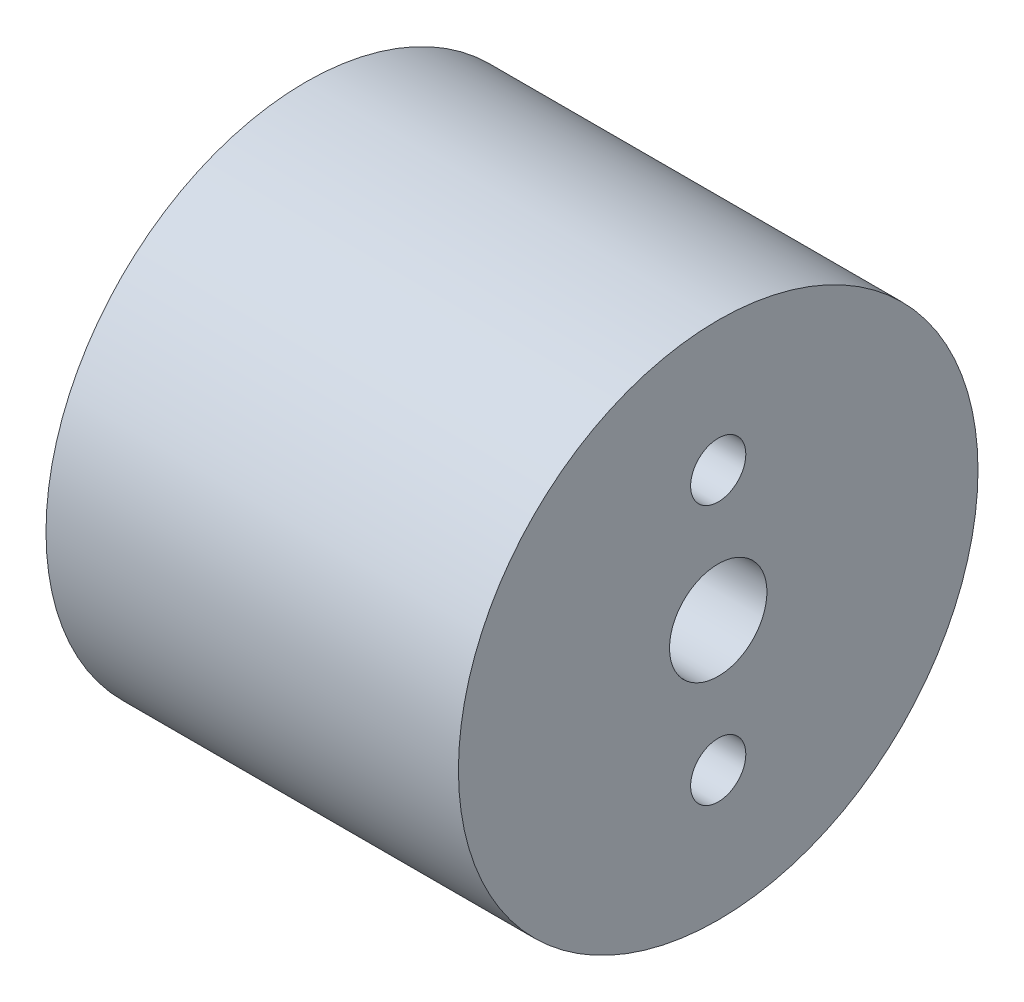
ISO-10303-21;
HEADER;
FILE_DESCRIPTION(('STEP AP214'),'2;1');
FILE_NAME('part.step','',(''),(''),'','','');
FILE_SCHEMA(('AUTOMOTIVE_DESIGN { 1 0 10303 214 1 1 1 1 }'));
ENDSEC;
DATA;
#1=APPLICATION_CONTEXT('core data for automotive mechanical design processes');
#2=APPLICATION_PROTOCOL_DEFINITION('international standard','automotive_design',2000,#1);
#3=PRODUCT_CONTEXT('',#1,'mechanical');
#4=PRODUCT('Part','Part','',(#3));
#5=PRODUCT_RELATED_PRODUCT_CATEGORY('part','',(#4));
#6=PRODUCT_DEFINITION_FORMATION('','',#4);
#7=PRODUCT_DEFINITION_CONTEXT('part definition',#1,'design');
#8=PRODUCT_DEFINITION('design','',#6,#7);
#9=PRODUCT_DEFINITION_SHAPE('','',#8);
#10=(LENGTH_UNIT() NAMED_UNIT(*) SI_UNIT(.MILLI.,.METRE.));
#11=(NAMED_UNIT(*) PLANE_ANGLE_UNIT() SI_UNIT($,.RADIAN.));
#12=(NAMED_UNIT(*) SI_UNIT($,.STERADIAN.) SOLID_ANGLE_UNIT());
#13=UNCERTAINTY_MEASURE_WITH_UNIT(LENGTH_MEASURE(1.E-05),#10,'distance_accuracy_value','');
#14=(GEOMETRIC_REPRESENTATION_CONTEXT(3) GLOBAL_UNCERTAINTY_ASSIGNED_CONTEXT((#13)) GLOBAL_UNIT_ASSIGNED_CONTEXT((#10,
#11,#12)) REPRESENTATION_CONTEXT('',''));
#15=CARTESIAN_POINT('',(0.,0.,0.));
#16=DIRECTION('',(0.,0.,1.));
#17=DIRECTION('',(1.,0.,0.));
#18=AXIS2_PLACEMENT_3D('',#15,#16,#17);
#19=CARTESIAN_POINT('',(0.,0.,0.));
#20=DIRECTION('',(1.,0.,0.));
#21=DIRECTION('',(0.,0.,-1.));
#22=AXIS2_PLACEMENT_3D('',#19,#20,#21);
#23=PLANE('',#22);
#24=CARTESIAN_POINT('',(0.,0.,0.));
#25=DIRECTION('',(1.,0.,0.));
#26=DIRECTION('',(0.,0.,-1.));
#27=AXIS2_PLACEMENT_3D('',#24,#25,#26);
#28=CIRCLE('',#27,16.);
#29=CARTESIAN_POINT('',(0.,0.,-16.));
#30=VERTEX_POINT('',#29);
#31=EDGE_CURVE('E10',#30,#30,#28,.T.);
#32=ORIENTED_EDGE('',*,*,#31,.F.);
#33=EDGE_LOOP('',(#32));
#34=FACE_BOUND('',#33,.T.);
#35=CARTESIAN_POINT('',(0.,0.,0.));
#36=DIRECTION('',(1.,0.,0.));
#37=DIRECTION('',(0.,0.,-1.));
#38=AXIS2_PLACEMENT_3D('',#35,#36,#37);
#39=CIRCLE('',#38,11.4);
#40=CARTESIAN_POINT('',(0.,0.,-11.4));
#41=VERTEX_POINT('',#40);
#42=EDGE_CURVE('E38',#41,#41,#39,.T.);
#43=ORIENTED_EDGE('',*,*,#42,.T.);
#44=EDGE_LOOP('',(#43));
#45=FACE_BOUND('',#44,.T.);
#46=ADVANCED_FACE('F31',(#34,#45),#23,.F.);
#47=CARTESIAN_POINT('',(6.7,0.,0.));
#48=DIRECTION('',(-1.,0.,0.));
#49=DIRECTION('',(0.,0.,1.));
#50=AXIS2_PLACEMENT_3D('',#47,#48,#49);
#51=CYLINDRICAL_SURFACE('',#50,16.);
#52=ORIENTED_EDGE('',*,*,#31,.T.);
#53=EDGE_LOOP('',(#52));
#54=FACE_BOUND('',#53,.T.);
#55=CARTESIAN_POINT('',(25.4,0.,0.));
#56=DIRECTION('',(1.,0.,0.));
#57=DIRECTION('',(0.,0.,-1.));
#58=AXIS2_PLACEMENT_3D('',#55,#56,#57);
#59=CIRCLE('',#58,16.);
#60=CARTESIAN_POINT('',(25.4,0.,-16.));
#61=VERTEX_POINT('',#60);
#62=EDGE_CURVE('E66',#61,#61,#59,.T.);
#63=ORIENTED_EDGE('',*,*,#62,.F.);
#64=EDGE_LOOP('',(#63));
#65=FACE_BOUND('',#64,.T.);
#66=ADVANCED_FACE('F33',(#54,#65),#51,.T.);
#67=CARTESIAN_POINT('',(6.7,0.,0.));
#68=DIRECTION('',(-1.,0.,0.));
#69=DIRECTION('',(0.,0.,1.));
#70=AXIS2_PLACEMENT_3D('',#67,#68,#69);
#71=CYLINDRICAL_SURFACE('',#70,11.4);
#72=CARTESIAN_POINT('',(6.7,0.,0.));
#73=DIRECTION('',(1.,0.,0.));
#74=DIRECTION('',(0.,0.,-1.));
#75=AXIS2_PLACEMENT_3D('',#72,#73,#74);
#76=CIRCLE('',#75,11.4);
#77=CARTESIAN_POINT('',(6.7,0.,-11.4));
#78=VERTEX_POINT('',#77);
#79=EDGE_CURVE('E42',#78,#78,#76,.T.);
#80=ORIENTED_EDGE('',*,*,#79,.T.);
#81=EDGE_LOOP('',(#80));
#82=FACE_BOUND('',#81,.T.);
#83=ORIENTED_EDGE('',*,*,#42,.F.);
#84=EDGE_LOOP('',(#83));
#85=FACE_BOUND('',#84,.T.);
#86=ADVANCED_FACE('F148',(#82,#85),#71,.F.);
#87=CARTESIAN_POINT('',(6.7,0.,0.));
#88=DIRECTION('',(1.,0.,0.));
#89=DIRECTION('',(0.,0.,-1.));
#90=AXIS2_PLACEMENT_3D('',#87,#88,#89);
#91=PLANE('',#90);
#92=CARTESIAN_POINT('',(6.7,0.,0.));
#93=DIRECTION('',(1.,0.,0.));
#94=DIRECTION('',(0.,0.,-1.));
#95=AXIS2_PLACEMENT_3D('',#92,#93,#94);
#96=CIRCLE('',#95,10.7);
#97=CARTESIAN_POINT('',(6.7,0.,-10.7));
#98=VERTEX_POINT('',#97);
#99=EDGE_CURVE('E46',#98,#98,#96,.T.);
#100=ORIENTED_EDGE('',*,*,#99,.T.);
#101=EDGE_LOOP('',(#100));
#102=FACE_BOUND('',#101,.T.);
#103=ORIENTED_EDGE('',*,*,#79,.F.);
#104=EDGE_LOOP('',(#103));
#105=FACE_BOUND('',#104,.T.);
#106=ADVANCED_FACE('F142',(#102,#105),#91,.F.);
#107=CARTESIAN_POINT('',(9.9,0.,0.));
#108=DIRECTION('',(-1.,0.,0.));
#109=DIRECTION('',(0.,0.,1.));
#110=AXIS2_PLACEMENT_3D('',#107,#108,#109);
#111=CYLINDRICAL_SURFACE('',#110,10.7);
#112=CARTESIAN_POINT('',(9.9,0.,0.));
#113=DIRECTION('',(1.,0.,0.));
#114=DIRECTION('',(0.,0.,-1.));
#115=AXIS2_PLACEMENT_3D('',#112,#113,#114);
#116=CIRCLE('',#115,10.7);
#117=CARTESIAN_POINT('',(9.9,0.,-10.7));
#118=VERTEX_POINT('',#117);
#119=EDGE_CURVE('E51',#118,#118,#116,.T.);
#120=ORIENTED_EDGE('',*,*,#119,.T.);
#121=EDGE_LOOP('',(#120));
#122=FACE_BOUND('',#121,.T.);
#123=ORIENTED_EDGE('',*,*,#99,.F.);
#124=EDGE_LOOP('',(#123));
#125=FACE_BOUND('',#124,.T.);
#126=ADVANCED_FACE('F135',(#122,#125),#111,.F.);
#127=CARTESIAN_POINT('',(9.9,0.,0.));
#128=DIRECTION('',(1.,0.,0.));
#129=DIRECTION('',(0.,0.,-1.));
#130=AXIS2_PLACEMENT_3D('',#127,#128,#129);
#131=PLANE('',#130);
#132=CARTESIAN_POINT('',(9.9,8.,0.));
#133=DIRECTION('',(1.,0.,0.));
#134=DIRECTION('',(0.,0.,-1.));
#135=AXIS2_PLACEMENT_3D('',#132,#133,#134);
#136=CIRCLE('',#135,1.7);
#137=CARTESIAN_POINT('',(9.9,8.,-1.7));
#138=VERTEX_POINT('',#137);
#139=EDGE_CURVE('E73',#138,#138,#136,.T.);
#140=ORIENTED_EDGE('',*,*,#139,.T.);
#141=EDGE_LOOP('',(#140));
#142=FACE_BOUND('',#141,.T.);
#143=CARTESIAN_POINT('',(9.9,-8.,0.));
#144=DIRECTION('',(1.,0.,0.));
#145=DIRECTION('',(0.,0.,-1.));
#146=AXIS2_PLACEMENT_3D('',#143,#144,#145);
#147=CIRCLE('',#146,1.7);
#148=CARTESIAN_POINT('',(9.9,-8.,-1.7));
#149=VERTEX_POINT('',#148);
#150=EDGE_CURVE('E78',#149,#149,#147,.T.);
#151=ORIENTED_EDGE('',*,*,#150,.T.);
#152=EDGE_LOOP('',(#151));
#153=FACE_BOUND('',#152,.T.);
#154=CARTESIAN_POINT('',(9.9,0.,0.));
#155=DIRECTION('',(1.,0.,0.));
#156=DIRECTION('',(0.,0.,-1.));
#157=AXIS2_PLACEMENT_3D('',#154,#155,#156);
#158=CIRCLE('',#157,6.2);
#159=CARTESIAN_POINT('',(9.9,0.,-6.2));
#160=VERTEX_POINT('',#159);
#161=EDGE_CURVE('E54',#160,#160,#158,.T.);
#162=ORIENTED_EDGE('',*,*,#161,.T.);
#163=EDGE_LOOP('',(#162));
#164=FACE_BOUND('',#163,.T.);
#165=ORIENTED_EDGE('',*,*,#119,.F.);
#166=EDGE_LOOP('',(#165));
#167=FACE_BOUND('',#166,.T.);
#168=ADVANCED_FACE('F129',(#142,#153,#164,#167),#131,.F.);
#169=CARTESIAN_POINT('',(10.9,0.,0.));
#170=DIRECTION('',(-1.,0.,0.));
#171=DIRECTION('',(0.,0.,1.));
#172=AXIS2_PLACEMENT_3D('',#169,#170,#171);
#173=CYLINDRICAL_SURFACE('',#172,6.2);
#174=CARTESIAN_POINT('',(10.9,0.,0.));
#175=DIRECTION('',(1.,0.,0.));
#176=DIRECTION('',(0.,0.,-1.));
#177=AXIS2_PLACEMENT_3D('',#174,#175,#176);
#178=CIRCLE('',#177,6.2);
#179=CARTESIAN_POINT('',(10.9,0.,-6.2));
#180=VERTEX_POINT('',#179);
#181=EDGE_CURVE('E57',#180,#180,#178,.T.);
#182=ORIENTED_EDGE('',*,*,#181,.T.);
#183=EDGE_LOOP('',(#182));
#184=FACE_BOUND('',#183,.T.);
#185=ORIENTED_EDGE('',*,*,#161,.F.);
#186=EDGE_LOOP('',(#185));
#187=FACE_BOUND('',#186,.T.);
#188=ADVANCED_FACE('F123',(#184,#187),#173,.F.);
#189=CARTESIAN_POINT('',(10.9,0.,0.));
#190=DIRECTION('',(1.,0.,0.));
#191=DIRECTION('',(0.,0.,-1.));
#192=AXIS2_PLACEMENT_3D('',#189,#190,#191);
#193=PLANE('',#192);
#194=CARTESIAN_POINT('',(10.9,0.,0.));
#195=DIRECTION('',(1.,0.,0.));
#196=DIRECTION('',(0.,0.,-1.));
#197=AXIS2_PLACEMENT_3D('',#194,#195,#196);
#198=CIRCLE('',#197,4.7);
#199=CARTESIAN_POINT('',(10.9,0.,-4.7));
#200=VERTEX_POINT('',#199);
#201=EDGE_CURVE('E60',#200,#200,#198,.T.);
#202=ORIENTED_EDGE('',*,*,#201,.T.);
#203=EDGE_LOOP('',(#202));
#204=FACE_BOUND('',#203,.T.);
#205=ORIENTED_EDGE('',*,*,#181,.F.);
#206=EDGE_LOOP('',(#205));
#207=FACE_BOUND('',#206,.T.);
#208=ADVANCED_FACE('F117',(#204,#207),#193,.F.);
#209=CARTESIAN_POINT('',(17.9,0.,0.));
#210=DIRECTION('',(-1.,0.,0.));
#211=DIRECTION('',(0.,0.,1.));
#212=AXIS2_PLACEMENT_3D('',#209,#210,#211);
#213=CYLINDRICAL_SURFACE('',#212,4.7);
#214=CARTESIAN_POINT('',(17.9,0.,0.));
#215=DIRECTION('',(1.,0.,0.));
#216=DIRECTION('',(0.,0.,-1.));
#217=AXIS2_PLACEMENT_3D('',#214,#215,#216);
#218=CIRCLE('',#217,4.7);
#219=CARTESIAN_POINT('',(17.9,0.,-4.7));
#220=VERTEX_POINT('',#219);
#221=EDGE_CURVE('E63',#220,#220,#218,.T.);
#222=ORIENTED_EDGE('',*,*,#221,.T.);
#223=EDGE_LOOP('',(#222));
#224=FACE_BOUND('',#223,.T.);
#225=ORIENTED_EDGE('',*,*,#201,.F.);
#226=EDGE_LOOP('',(#225));
#227=FACE_BOUND('',#226,.T.);
#228=ADVANCED_FACE('F111',(#224,#227),#213,.F.);
#229=CARTESIAN_POINT('',(17.9,0.,0.));
#230=DIRECTION('',(1.,0.,0.));
#231=DIRECTION('',(0.,0.,-1.));
#232=AXIS2_PLACEMENT_3D('',#229,#230,#231);
#233=PLANE('',#232);
#234=CARTESIAN_POINT('',(17.9,0.,0.));
#235=DIRECTION('',(1.,0.,0.));
#236=DIRECTION('',(0.,0.,-1.));
#237=AXIS2_PLACEMENT_3D('',#234,#235,#236);
#238=CIRCLE('',#237,3.);
#239=CARTESIAN_POINT('',(17.9,0.,3.));
#240=VERTEX_POINT('',#239);
#241=EDGE_CURVE('E70',#240,#240,#238,.T.);
#242=ORIENTED_EDGE('',*,*,#241,.T.);
#243=EDGE_LOOP('',(#242));
#244=FACE_BOUND('',#243,.T.);
#245=ORIENTED_EDGE('',*,*,#221,.F.);
#246=EDGE_LOOP('',(#245));
#247=FACE_BOUND('',#246,.T.);
#248=ADVANCED_FACE('F95',(#244,#247),#233,.F.);
#249=CARTESIAN_POINT('',(25.4,0.,0.));
#250=DIRECTION('',(1.,0.,0.));
#251=DIRECTION('',(0.,0.,-1.));
#252=AXIS2_PLACEMENT_3D('',#249,#250,#251);
#253=PLANE('',#252);
#254=CARTESIAN_POINT('',(25.4,8.,0.));
#255=DIRECTION('',(1.,0.,0.));
#256=DIRECTION('',(0.,0.,-1.));
#257=AXIS2_PLACEMENT_3D('',#254,#255,#256);
#258=CIRCLE('',#257,1.7);
#259=CARTESIAN_POINT('',(25.4,8.,-1.7));
#260=VERTEX_POINT('',#259);
#261=EDGE_CURVE('E81',#260,#260,#258,.T.);
#262=ORIENTED_EDGE('',*,*,#261,.F.);
#263=EDGE_LOOP('',(#262));
#264=FACE_BOUND('',#263,.T.);
#265=CARTESIAN_POINT('',(25.4,-8.,0.));
#266=DIRECTION('',(1.,0.,0.));
#267=DIRECTION('',(0.,0.,-1.));
#268=AXIS2_PLACEMENT_3D('',#265,#266,#267);
#269=CIRCLE('',#268,1.7);
#270=CARTESIAN_POINT('',(25.4,-8.,-1.7));
#271=VERTEX_POINT('',#270);
#272=EDGE_CURVE('E82',#271,#271,#269,.T.);
#273=ORIENTED_EDGE('',*,*,#272,.F.);
#274=EDGE_LOOP('',(#273));
#275=FACE_BOUND('',#274,.T.);
#276=ORIENTED_EDGE('',*,*,#62,.T.);
#277=EDGE_LOOP('',(#276));
#278=FACE_BOUND('',#277,.T.);
#279=CARTESIAN_POINT('',(25.4,0.,0.));
#280=DIRECTION('',(1.,0.,0.));
#281=DIRECTION('',(0.,0.,-1.));
#282=AXIS2_PLACEMENT_3D('',#279,#280,#281);
#283=CIRCLE('',#282,3.);
#284=CARTESIAN_POINT('',(25.4,0.,3.));
#285=VERTEX_POINT('',#284);
#286=EDGE_CURVE('E69',#285,#285,#283,.T.);
#287=ORIENTED_EDGE('',*,*,#286,.F.);
#288=EDGE_LOOP('',(#287));
#289=FACE_BOUND('',#288,.T.);
#290=ADVANCED_FACE('F91',(#264,#275,#278,#289),#253,.T.);
#291=CARTESIAN_POINT('',(25.4,0.,0.));
#292=DIRECTION('',(-1.,0.,0.));
#293=DIRECTION('',(0.,0.,1.));
#294=AXIS2_PLACEMENT_3D('',#291,#292,#293);
#295=CYLINDRICAL_SURFACE('',#294,3.);
#296=CARTESIAN_POINT('',(25.4,0.,3.));
#297=CARTESIAN_POINT('',(25.321875,0.,3.));
#298=CARTESIAN_POINT('',(25.24375,0.,3.));
#299=CARTESIAN_POINT('',(25.0875,0.,3.));
#300=CARTESIAN_POINT('',(25.009375,0.,3.));
#301=CARTESIAN_POINT('',(24.853125,0.,3.));
#302=CARTESIAN_POINT('',(24.775,0.,3.));
#303=CARTESIAN_POINT('',(24.61875,0.,3.));
#304=CARTESIAN_POINT('',(24.540625,0.,3.));
#305=CARTESIAN_POINT('',(24.384375,0.,3.));
#306=CARTESIAN_POINT('',(24.30625,0.,3.));
#307=CARTESIAN_POINT('',(24.15,0.,3.));
#308=CARTESIAN_POINT('',(24.071875,0.,3.));
#309=CARTESIAN_POINT('',(23.915625,0.,3.));
#310=CARTESIAN_POINT('',(23.8375,0.,3.));
#311=CARTESIAN_POINT('',(23.68125,0.,3.));
#312=CARTESIAN_POINT('',(23.603125,0.,3.));
#313=CARTESIAN_POINT('',(23.446875,0.,3.));
#314=CARTESIAN_POINT('',(23.36875,0.,3.));
#315=CARTESIAN_POINT('',(23.2125,0.,3.));
#316=CARTESIAN_POINT('',(23.134375,0.,3.));
#317=CARTESIAN_POINT('',(22.978125,0.,3.));
#318=CARTESIAN_POINT('',(22.9,0.,3.));
#319=CARTESIAN_POINT('',(22.74375,0.,3.));
#320=CARTESIAN_POINT('',(22.665625,0.,3.));
#321=CARTESIAN_POINT('',(22.509375,0.,3.));
#322=CARTESIAN_POINT('',(22.43125,0.,3.));
#323=CARTESIAN_POINT('',(22.275,0.,3.));
#324=CARTESIAN_POINT('',(22.196875,0.,3.));
#325=CARTESIAN_POINT('',(22.040625,0.,3.));
#326=CARTESIAN_POINT('',(21.9625,0.,3.));
#327=CARTESIAN_POINT('',(21.80625,0.,3.));
#328=CARTESIAN_POINT('',(21.728125,0.,3.));
#329=CARTESIAN_POINT('',(21.571875,0.,3.));
#330=CARTESIAN_POINT('',(21.49375,0.,3.));
#331=CARTESIAN_POINT('',(21.3375,0.,3.));
#332=CARTESIAN_POINT('',(21.259375,0.,3.));
#333=CARTESIAN_POINT('',(21.103125,0.,3.));
#334=CARTESIAN_POINT('',(21.025,0.,3.));
#335=CARTESIAN_POINT('',(20.86875,0.,3.));
#336=CARTESIAN_POINT('',(20.790625,0.,3.));
#337=CARTESIAN_POINT('',(20.634375,0.,3.));
#338=CARTESIAN_POINT('',(20.55625,0.,3.));
#339=CARTESIAN_POINT('',(20.4,0.,3.));
#340=CARTESIAN_POINT('',(20.321875,0.,3.));
#341=CARTESIAN_POINT('',(20.165625,0.,3.));
#342=CARTESIAN_POINT('',(20.0875,0.,3.));
#343=CARTESIAN_POINT('',(19.93125,0.,3.));
#344=CARTESIAN_POINT('',(19.853125,0.,3.));
#345=CARTESIAN_POINT('',(19.696875,0.,3.));
#346=CARTESIAN_POINT('',(19.61875,0.,3.));
#347=CARTESIAN_POINT('',(19.4625,0.,3.));
#348=CARTESIAN_POINT('',(19.384375,0.,3.));
#349=CARTESIAN_POINT('',(19.228125,0.,3.));
#350=CARTESIAN_POINT('',(19.15,0.,3.));
#351=CARTESIAN_POINT('',(18.99375,0.,3.));
#352=CARTESIAN_POINT('',(18.915625,0.,3.));
#353=CARTESIAN_POINT('',(18.759375,0.,3.));
#354=CARTESIAN_POINT('',(18.68125,0.,3.));
#355=CARTESIAN_POINT('',(18.525,0.,3.));
#356=CARTESIAN_POINT('',(18.446875,0.,3.));
#357=CARTESIAN_POINT('',(18.290625,0.,3.));
#358=CARTESIAN_POINT('',(18.2125,0.,3.));
#359=CARTESIAN_POINT('',(18.05625,0.,3.));
#360=CARTESIAN_POINT('',(17.978125,0.,3.));
#361=CARTESIAN_POINT('',(17.9,0.,3.));
#362=B_SPLINE_CURVE_WITH_KNOTS('',3,(#296,#297,#298,#299,#300,#301,#302,#303,#304,#305,#306,
#307,#308,#309,#310,#311,#312,#313,#314,#315,#316,#317,#318,#319,#320,#321,#322,#323,#324,#325,
#326,#327,#328,#329,#330,#331,#332,#333,#334,#335,#336,#337,#338,#339,#340,#341,#342,#343,#344,
#345,#346,#347,#348,#349,#350,#351,#352,#353,#354,#355,#356,#357,#358,#359,#360,#361),
.UNSPECIFIED.,.F.,.F.,(4,2,2,2,2,2,2,2,2,2,2,2,2,2,2,2,2,2,2,2,2,2,2,2,2,2,2,2,2,2,2,2,4),(0.,
0.234375000000002,0.46875,0.703125000000002,0.937500000000001,1.171875,1.40625,1.640625,1.875,
2.109375,2.34375,2.578125,2.8125,3.046875,3.28125,3.515625,3.75,3.984375,4.21875,4.453125,
4.6875,4.921875,5.15625,5.390625,5.625,5.859375,6.09375,6.328125,6.5625,6.796875,7.03125,
7.265625,7.5),.UNSPECIFIED.);
#363=EDGE_CURVE('BSEAM94',#285,#240,#362,.T.);
#364=ORIENTED_EDGE('',*,*,#286,.T.);
#365=ORIENTED_EDGE('',*,*,#241,.F.);
#366=ORIENTED_EDGE('',*,*,#363,.T.);
#367=ORIENTED_EDGE('',*,*,#363,.F.);
#368=EDGE_LOOP('',(#364,#366,#365,#367));
#369=FACE_BOUND('',#368,.T.);
#370=ADVANCED_FACE('F94',(#369),#295,.F.);
#371=CARTESIAN_POINT('',(0.,-8.,0.));
#372=DIRECTION('',(1.,0.,0.));
#373=DIRECTION('',(0.,0.,-1.));
#374=AXIS2_PLACEMENT_3D('',#371,#372,#373);
#375=CYLINDRICAL_SURFACE('',#374,1.7);
#376=ORIENTED_EDGE('',*,*,#272,.T.);
#377=EDGE_LOOP('',(#376));
#378=FACE_BOUND('',#377,.T.);
#379=ORIENTED_EDGE('',*,*,#150,.F.);
#380=EDGE_LOOP('',(#379));
#381=FACE_BOUND('',#380,.T.);
#382=ADVANCED_FACE('F105',(#378,#381),#375,.F.);
#383=CARTESIAN_POINT('',(0.,8.,0.));
#384=DIRECTION('',(1.,0.,0.));
#385=DIRECTION('',(0.,0.,-1.));
#386=AXIS2_PLACEMENT_3D('',#383,#384,#385);
#387=CYLINDRICAL_SURFACE('',#386,1.7);
#388=ORIENTED_EDGE('',*,*,#261,.T.);
#389=EDGE_LOOP('',(#388));
#390=FACE_BOUND('',#389,.T.);
#391=ORIENTED_EDGE('',*,*,#139,.F.);
#392=EDGE_LOOP('',(#391));
#393=FACE_BOUND('',#392,.T.);
#394=ADVANCED_FACE('F88',(#390,#393),#387,.F.);
#395=CLOSED_SHELL('',(#46,#66,#86,#106,#126,#168,#188,#208,#228,#248,#290,#370,#382,#394));
#396=MANIFOLD_SOLID_BREP('B2',#395);
#397=ADVANCED_BREP_SHAPE_REPRESENTATION('',(#18,#396),#14);
#398=SHAPE_DEFINITION_REPRESENTATION(#9,#397);
ENDSEC;
END-ISO-10303-21;
